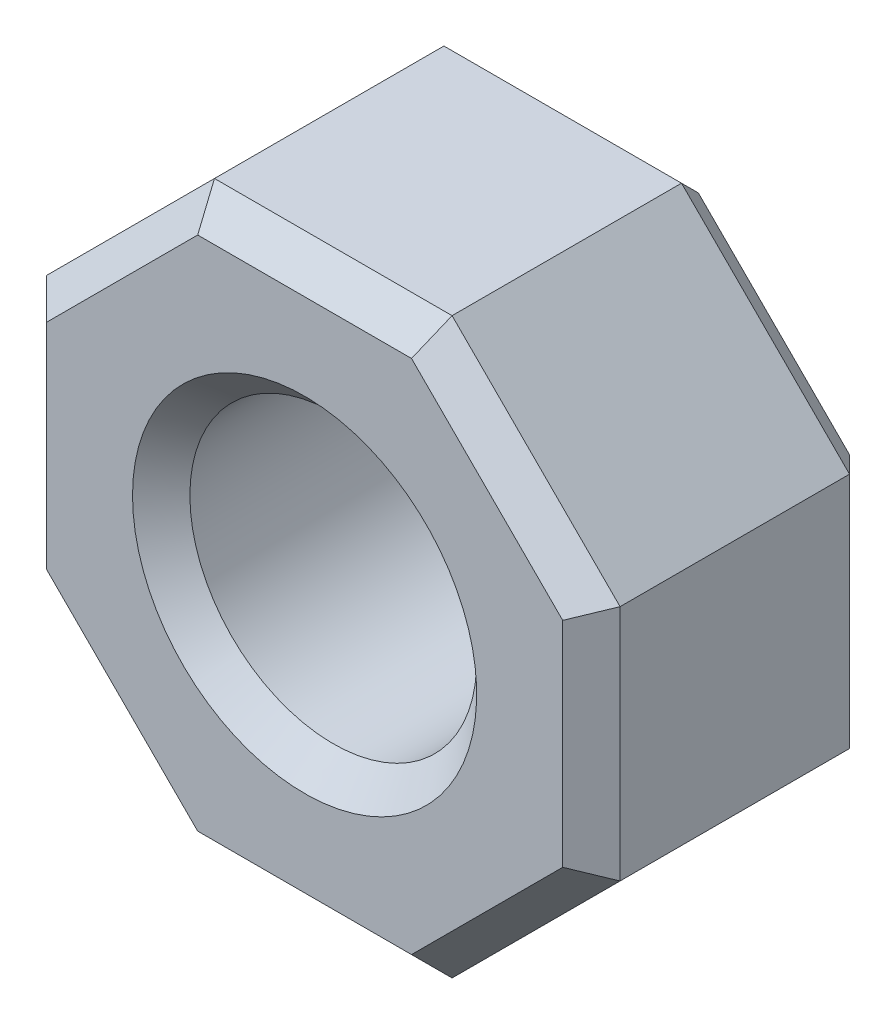
ISO-10303-21;
HEADER;
FILE_DESCRIPTION(('STEP AP214'),'2;1');
FILE_NAME('part.step','',(''),(''),'','','');
FILE_SCHEMA(('AUTOMOTIVE_DESIGN { 1 0 10303 214 1 1 1 1 }'));
ENDSEC;
DATA;
#1=APPLICATION_CONTEXT('core data for automotive mechanical design processes');
#2=APPLICATION_PROTOCOL_DEFINITION('international standard','automotive_design',2000,#1);
#3=PRODUCT_CONTEXT('',#1,'mechanical');
#4=PRODUCT('Part','Part','',(#3));
#5=PRODUCT_RELATED_PRODUCT_CATEGORY('part','',(#4));
#6=PRODUCT_DEFINITION_FORMATION('','',#4);
#7=PRODUCT_DEFINITION_CONTEXT('part definition',#1,'design');
#8=PRODUCT_DEFINITION('design','',#6,#7);
#9=PRODUCT_DEFINITION_SHAPE('','',#8);
#10=(LENGTH_UNIT() NAMED_UNIT(*) SI_UNIT(.MILLI.,.METRE.));
#11=(NAMED_UNIT(*) PLANE_ANGLE_UNIT() SI_UNIT($,.RADIAN.));
#12=(NAMED_UNIT(*) SI_UNIT($,.STERADIAN.) SOLID_ANGLE_UNIT());
#13=UNCERTAINTY_MEASURE_WITH_UNIT(LENGTH_MEASURE(1.E-05),#10,'distance_accuracy_value','');
#14=(GEOMETRIC_REPRESENTATION_CONTEXT(3) GLOBAL_UNCERTAINTY_ASSIGNED_CONTEXT((#13)) GLOBAL_UNIT_ASSIGNED_CONTEXT((#10,
#11,#12)) REPRESENTATION_CONTEXT('',''));
#15=CARTESIAN_POINT('',(0.,0.,0.));
#16=DIRECTION('',(0.,0.,1.));
#17=DIRECTION('',(1.,0.,0.));
#18=AXIS2_PLACEMENT_3D('',#15,#16,#17);
#19=CARTESIAN_POINT('',(25.0000000000003,25.0000000000007,25.000000000001));
#20=DIRECTION('',(0.,0.,-0.999999999999998));
#21=DIRECTION('',(-1.00000000000002,0.,0.));
#22=AXIS2_PLACEMENT_3D('',#19,#20,#21);
#23=PLANE('',#22);
#24=CARTESIAN_POINT('',(0.,1.11022302462516E-13,24.9999999999999));
#25=DIRECTION('',(0.,0.,-0.999999999999998));
#26=DIRECTION('',(-1.00000000000002,0.,0.));
#27=AXIS2_PLACEMENT_3D('',#24,#25,#26);
#28=CIRCLE('',#27,15.);
#29=CARTESIAN_POINT('',(-15.0000000000004,1.1518563880486E-13,24.9999999999999));
#30=VERTEX_POINT('',#29);
#31=EDGE_CURVE('E227',#30,#30,#28,.T.);
#32=ORIENTED_EDGE('',*,*,#31,.T.);
#33=EDGE_LOOP('',(#32));
#34=FACE_BOUND('',#33,.T.);
#35=DIRECTION('',(0.,1.00000000000002,0.));
#36=VECTOR('',#35,1.);
#37=CARTESIAN_POINT('',(22.5000000000006,25.0000000000012,25.0000000000006));
#38=LINE('',#37,#36);
#39=CARTESIAN_POINT('',(22.5000000000014,-9.31980515339428,25.0000000000019));
#40=VERTEX_POINT('',#39);
#41=CARTESIAN_POINT('',(22.5000000000003,9.31980515339542,25.0000000000019));
#42=VERTEX_POINT('',#41);
#43=EDGE_CURVE('E222',#40,#42,#38,.T.);
#44=ORIENTED_EDGE('',*,*,#43,.T.);
#45=DIRECTION('',(-0.707106781186565,0.707106781186561,0.));
#46=VECTOR('',#45,1.);
#47=CARTESIAN_POINT('',(15.9099025766984,15.9099025766978,25.0000000000001));
#48=LINE('',#47,#46);
#49=CARTESIAN_POINT('',(9.31980515339478,22.5000000000008,25.0000000000037));
#50=VERTEX_POINT('',#49);
#51=EDGE_CURVE('E224',#42,#50,#48,.T.);
#52=ORIENTED_EDGE('',*,*,#51,.T.);
#53=DIRECTION('',(-1.00000000000002,0.,0.));
#54=VECTOR('',#53,1.);
#55=CARTESIAN_POINT('',(25.0000000000004,22.5000000000011,25.0000000000019));
#56=LINE('',#55,#54);
#57=CARTESIAN_POINT('',(-9.31980515339506,22.5000000000011,25.0000000000017));
#58=VERTEX_POINT('',#57);
#59=EDGE_CURVE('E210',#50,#58,#56,.T.);
#60=ORIENTED_EDGE('',*,*,#59,.T.);
#61=DIRECTION('',(-0.707106781186559,-0.707106781186568,0.));
#62=VECTOR('',#61,1.);
#63=CARTESIAN_POINT('',(9.090097423302,40.9099025766983,24.9999999999966));
#64=LINE('',#63,#62);
#65=CARTESIAN_POINT('',(-22.5000000000007,9.31980515339506,25.0000000000035));
#66=VERTEX_POINT('',#65);
#67=EDGE_CURVE('E212',#58,#66,#64,.T.);
#68=ORIENTED_EDGE('',*,*,#67,.T.);
#69=DIRECTION('',(0.,-1.00000000000002,0.));
#70=VECTOR('',#69,1.);
#71=CARTESIAN_POINT('',(-22.500000000002,25.000000000001,25.0000000000032));
#72=LINE('',#71,#70);
#73=CARTESIAN_POINT('',(-22.5000000000019,-9.31980515339476,25.0000000000017));
#74=VERTEX_POINT('',#73);
#75=EDGE_CURVE('E214',#66,#74,#72,.T.);
#76=ORIENTED_EDGE('',*,*,#75,.T.);
#77=DIRECTION('',(0.707106781186565,-0.707106781186561,0.));
#78=VECTOR('',#77,1.);
#79=CARTESIAN_POINT('',(-15.9099025766985,-15.9099025766972,25.0000000000017));
#80=LINE('',#79,#78);
#81=CARTESIAN_POINT('',(-9.31980515339573,-22.5000000000001,24.9999999999999));
#82=VERTEX_POINT('',#81);
#83=EDGE_CURVE('E216',#74,#82,#80,.T.);
#84=ORIENTED_EDGE('',*,*,#83,.T.);
#85=DIRECTION('',(1.00000000000002,0.,0.));
#86=VECTOR('',#85,1.);
#87=CARTESIAN_POINT('',(25.0000000000002,-22.5000000000003,25.0000000000055));
#88=LINE('',#87,#86);
#89=CARTESIAN_POINT('',(9.31980515339392,-22.5,25.0000000000035));
#90=VERTEX_POINT('',#89);
#91=EDGE_CURVE('E218',#82,#90,#88,.T.);
#92=ORIENTED_EDGE('',*,*,#91,.T.);
#93=DIRECTION('',(0.707106781186559,0.707106781186567,0.));
#94=VECTOR('',#93,1.);
#95=CARTESIAN_POINT('',(40.9099025766981,9.0900974233035,25.000000000003));
#96=LINE('',#95,#94);
#97=EDGE_CURVE('E220',#90,#40,#96,.T.);
#98=ORIENTED_EDGE('',*,*,#97,.T.);
#99=EDGE_LOOP('',(#44,#52,#60,#68,#76,#84,#92,#98));
#100=FACE_BOUND('',#99,.T.);
#101=ADVANCED_FACE('F34',(#34,#100),#23,.F.);
#102=CARTESIAN_POINT('',(25.0000000000006,25.0000000000007,1.77635683940025E-12));
#103=DIRECTION('',(0.,0.,-0.999999999999998));
#104=DIRECTION('',(-1.00000000000002,0.,0.));
#105=AXIS2_PLACEMENT_3D('',#102,#103,#104);
#106=PLANE('',#105);
#107=CARTESIAN_POINT('',(0.,0.,0.));
#108=DIRECTION('',(0.,0.,-0.999999999999998));
#109=DIRECTION('',(-1.00000000000002,0.,0.));
#110=AXIS2_PLACEMENT_3D('',#107,#108,#109);
#111=CIRCLE('',#110,15.);
#112=CARTESIAN_POINT('',(-15.0000000000003,0.,0.));
#113=VERTEX_POINT('',#112);
#114=EDGE_CURVE('E174',#113,#113,#111,.F.);
#115=ORIENTED_EDGE('',*,*,#114,.T.);
#116=EDGE_LOOP('',(#115));
#117=FACE_BOUND('',#116,.T.);
#118=DIRECTION('',(0.,1.00000000000002,0.));
#119=VECTOR('',#118,1.);
#120=CARTESIAN_POINT('',(-22.5000000000001,10.3553390593274,3.5527136788005E-12));
#121=LINE('',#120,#119);
#122=CARTESIAN_POINT('',(-22.5000000000019,-9.31980515339487,1.77635683940025E-12));
#123=VERTEX_POINT('',#122);
#124=CARTESIAN_POINT('',(-22.5000000000013,9.31980515339456,3.5527136788005E-12));
#125=VERTEX_POINT('',#124);
#126=EDGE_CURVE('E173',#123,#125,#121,.T.);
#127=ORIENTED_EDGE('',*,*,#126,.T.);
#128=DIRECTION('',(0.707106781186559,0.707106781186568,0.));
#129=VECTOR('',#128,1.);
#130=CARTESIAN_POINT('',(-8.58757210636099,23.2322330470339,1.77635683940025E-12));
#131=LINE('',#130,#129);
#132=CARTESIAN_POINT('',(-9.31980515339417,22.5000000000006,1.77635683940025E-12));
#133=VERTEX_POINT('',#132);
#134=EDGE_CURVE('E152',#125,#133,#131,.T.);
#135=ORIENTED_EDGE('',*,*,#134,.T.);
#136=DIRECTION('',(1.00000000000002,0.,0.));
#137=VECTOR('',#136,1.);
#138=CARTESIAN_POINT('',(10.3553390593278,22.5000000000006,1.77635683940025E-12));
#139=LINE('',#138,#137);
#140=CARTESIAN_POINT('',(9.31980515339514,22.5000000000009,3.5527136788005E-12));
#141=VERTEX_POINT('',#140);
#142=EDGE_CURVE('E162',#133,#141,#139,.T.);
#143=ORIENTED_EDGE('',*,*,#142,.T.);
#144=DIRECTION('',(0.707106781186565,-0.707106781186561,0.));
#145=VECTOR('',#144,1.);
#146=CARTESIAN_POINT('',(23.2322330470343,8.58757210636138,1.77635683940025E-12));
#147=LINE('',#146,#145);
#148=CARTESIAN_POINT('',(22.500000000001,9.31980515339509,1.77635683940025E-12));
#149=VERTEX_POINT('',#148);
#150=EDGE_CURVE('E168',#141,#149,#147,.T.);
#151=ORIENTED_EDGE('',*,*,#150,.T.);
#152=DIRECTION('',(0.,-1.00000000000002,0.));
#153=VECTOR('',#152,1.);
#154=CARTESIAN_POINT('',(22.5,-10.3553390593276,1.77635683940025E-12));
#155=LINE('',#154,#153);
#156=CARTESIAN_POINT('',(22.5,-9.31980515339458,1.77635683940025E-12));
#157=VERTEX_POINT('',#156);
#158=EDGE_CURVE('E352',#149,#157,#155,.T.);
#159=ORIENTED_EDGE('',*,*,#158,.T.);
#160=DIRECTION('',(-0.707106781186559,-0.707106781186567,0.));
#161=VECTOR('',#160,1.);
#162=CARTESIAN_POINT('',(8.58757210636055,-23.2322330470337,5.32907051820075E-12));
#163=LINE('',#162,#161);
#164=CARTESIAN_POINT('',(9.3198051533937,-22.5000000000002,3.5527136788005E-12));
#165=VERTEX_POINT('',#164);
#166=EDGE_CURVE('E354',#157,#165,#163,.T.);
#167=ORIENTED_EDGE('',*,*,#166,.T.);
#168=DIRECTION('',(-1.00000000000002,0.,0.));
#169=VECTOR('',#168,1.);
#170=CARTESIAN_POINT('',(-10.3553390593287,-22.5000000000005,0.));
#171=LINE('',#170,#169);
#172=CARTESIAN_POINT('',(-9.31980515339573,-22.5000000000004,0.));
#173=VERTEX_POINT('',#172);
#174=EDGE_CURVE('E356',#165,#173,#171,.T.);
#175=ORIENTED_EDGE('',*,*,#174,.T.);
#176=DIRECTION('',(-0.707106781186565,0.707106781186561,0.));
#177=VECTOR('',#176,1.);
#178=CARTESIAN_POINT('',(-23.232233047034,-8.58757210636123,1.77635683940025E-12));
#179=LINE('',#178,#177);
#180=EDGE_CURVE('E179',#173,#123,#179,.T.);
#181=ORIENTED_EDGE('',*,*,#180,.T.);
#182=EDGE_LOOP('',(#127,#135,#143,#151,#159,#167,#175,#181));
#183=FACE_BOUND('',#182,.T.);
#184=ADVANCED_FACE('F171',(#117,#183),#106,.T.);
#185=CARTESIAN_POINT('',(-10.3553390593283,25.0000000000008,25.0000000000035));
#186=DIRECTION('',(0.,-1.00000000000002,0.));
#187=DIRECTION('',(1.00000000000002,0.,0.));
#188=AXIS2_PLACEMENT_3D('',#185,#186,#187);
#189=PLANE('',#188);
#190=DIRECTION('',(0.,0.,-0.999999999999998));
#191=VECTOR('',#190,1.);
#192=CARTESIAN_POINT('',(-10.3553390593283,25.0000000000008,25.0000000000035));
#193=LINE('',#192,#191);
#194=CARTESIAN_POINT('',(-10.3553390593275,25.0000000000013,22.5000000000035));
#195=VERTEX_POINT('',#194);
#196=CARTESIAN_POINT('',(-10.3553390593272,25.0000000000012,2.5000000000035));
#197=VERTEX_POINT('',#196);
#198=EDGE_CURVE('E169',#195,#197,#193,.T.);
#199=ORIENTED_EDGE('',*,*,#198,.F.);
#200=DIRECTION('',(1.00000000000002,0.,0.));
#201=VECTOR('',#200,1.);
#202=CARTESIAN_POINT('',(-10.3553390593275,25.0000000000013,22.5000000000035));
#203=LINE('',#202,#201);
#204=CARTESIAN_POINT('',(10.355339059327,25.0000000000012,22.5000000000035));
#205=VERTEX_POINT('',#204);
#206=EDGE_CURVE('E11',#195,#205,#203,.T.);
#207=ORIENTED_EDGE('',*,*,#206,.T.);
#208=DIRECTION('',(0.,0.,-0.999999999999998));
#209=VECTOR('',#208,1.);
#210=CARTESIAN_POINT('',(10.355339059327,25.000000000001,25.0000000000037));
#211=LINE('',#210,#209);
#212=CARTESIAN_POINT('',(10.355339059327,25.0000000000015,2.5000000000035));
#213=VERTEX_POINT('',#212);
#214=EDGE_CURVE('E287',#205,#213,#211,.T.);
#215=ORIENTED_EDGE('',*,*,#214,.T.);
#216=DIRECTION('',(-1.00000000000002,0.,0.));
#217=VECTOR('',#216,1.);
#218=CARTESIAN_POINT('',(-10.3553390593272,25.0000000000012,2.5000000000035));
#219=LINE('',#218,#217);
#220=EDGE_CURVE('E204',#213,#197,#219,.T.);
#221=ORIENTED_EDGE('',*,*,#220,.T.);
#222=EDGE_LOOP('',(#199,#207,#215,#221));
#223=FACE_BOUND('',#222,.T.);
#224=ADVANCED_FACE('F36',(#223),#189,.F.);
#225=CARTESIAN_POINT('',(-25.0000000000006,10.3553390593278,25.0000000000035));
#226=DIRECTION('',(0.707106781186565,-0.707106781186559,0.));
#227=DIRECTION('',(0.707106781186559,0.707106781186565,0.));
#228=AXIS2_PLACEMENT_3D('',#225,#226,#227);
#229=PLANE('',#228);
#230=DIRECTION('',(0.,0.,-0.999999999999998));
#231=VECTOR('',#230,1.);
#232=CARTESIAN_POINT('',(-25.0000000000006,10.3553390593278,25.0000000000035));
#233=LINE('',#232,#231);
#234=CARTESIAN_POINT('',(-25.0000000000003,10.3553390593278,22.5000000000035));
#235=VERTEX_POINT('',#234);
#236=CARTESIAN_POINT('',(-25.0000000000003,10.355339059328,2.5000000000035));
#237=VERTEX_POINT('',#236);
#238=EDGE_CURVE('E254',#235,#237,#233,.T.);
#239=ORIENTED_EDGE('',*,*,#238,.F.);
#240=DIRECTION('',(0.707106781186559,0.707106781186565,0.));
#241=VECTOR('',#240,1.);
#242=CARTESIAN_POINT('',(-25.0000000000003,10.3553390593278,22.5000000000035));
#243=LINE('',#242,#241);
#244=EDGE_CURVE('E42',#235,#195,#243,.T.);
#245=ORIENTED_EDGE('',*,*,#244,.T.);
#246=ORIENTED_EDGE('',*,*,#198,.T.);
#247=DIRECTION('',(-0.707106781186559,-0.707106781186565,0.));
#248=VECTOR('',#247,1.);
#249=CARTESIAN_POINT('',(-25.0000000000003,10.355339059328,2.5000000000035));
#250=LINE('',#249,#248);
#251=EDGE_CURVE('E155',#197,#237,#250,.T.);
#252=ORIENTED_EDGE('',*,*,#251,.T.);
#253=EDGE_LOOP('',(#239,#245,#246,#252));
#254=FACE_BOUND('',#253,.T.);
#255=ADVANCED_FACE('F365',(#254),#229,.F.);
#256=CARTESIAN_POINT('',(-25.,-10.3553390593272,25.0000000000017));
#257=DIRECTION('',(1.00000000000002,0.,0.));
#258=DIRECTION('',(0.,0.,-0.999999999999998));
#259=AXIS2_PLACEMENT_3D('',#256,#257,#258);
#260=PLANE('',#259);
#261=DIRECTION('',(0.,0.,-0.999999999999998));
#262=VECTOR('',#261,1.);
#263=CARTESIAN_POINT('',(-25.,-10.3553390593272,25.0000000000017));
#264=LINE('',#263,#262);
#265=CARTESIAN_POINT('',(-25.0000000000002,-10.3553390593275,22.5000000000017));
#266=VERTEX_POINT('',#265);
#267=CARTESIAN_POINT('',(-25.0000000000012,-10.3553390593274,2.50000000000172));
#268=VERTEX_POINT('',#267);
#269=EDGE_CURVE('E245',#266,#268,#264,.T.);
#270=ORIENTED_EDGE('',*,*,#269,.F.);
#271=DIRECTION('',(0.,1.00000000000002,0.));
#272=VECTOR('',#271,1.);
#273=CARTESIAN_POINT('',(-25.0000000000002,-10.3553390593275,22.5000000000017));
#274=LINE('',#273,#272);
#275=EDGE_CURVE('E56',#266,#235,#274,.T.);
#276=ORIENTED_EDGE('',*,*,#275,.T.);
#277=ORIENTED_EDGE('',*,*,#238,.T.);
#278=DIRECTION('',(0.,-1.00000000000002,0.));
#279=VECTOR('',#278,1.);
#280=CARTESIAN_POINT('',(-25.0000000000012,-10.3553390593274,2.50000000000172));
#281=LINE('',#280,#279);
#282=EDGE_CURVE('E186',#237,#268,#281,.T.);
#283=ORIENTED_EDGE('',*,*,#282,.T.);
#284=EDGE_LOOP('',(#270,#276,#277,#283));
#285=FACE_BOUND('',#284,.T.);
#286=ADVANCED_FACE('F251',(#285),#260,.F.);
#287=CARTESIAN_POINT('',(-10.3553390593289,-25.0000000000001,25.0000000000017));
#288=DIRECTION('',(0.707106781186561,0.707106781186565,0.));
#289=DIRECTION('',(-0.707106781186565,0.707106781186561,0.));
#290=AXIS2_PLACEMENT_3D('',#287,#288,#289);
#291=PLANE('',#290);
#292=DIRECTION('',(0.,0.,-0.999999999999998));
#293=VECTOR('',#292,1.);
#294=CARTESIAN_POINT('',(-10.3553390593289,-25.0000000000001,25.0000000000017));
#295=LINE('',#294,#293);
#296=CARTESIAN_POINT('',(-10.3553390593289,-25.0000000000001,22.5000000000017));
#297=VERTEX_POINT('',#296);
#298=CARTESIAN_POINT('',(-10.3553390593295,-25.0000000000003,2.50000000000172));
#299=VERTEX_POINT('',#298);
#300=EDGE_CURVE('E246',#297,#299,#295,.T.);
#301=ORIENTED_EDGE('',*,*,#300,.F.);
#302=DIRECTION('',(-0.707106781186565,0.707106781186561,0.));
#303=VECTOR('',#302,1.);
#304=CARTESIAN_POINT('',(-10.3553390593289,-25.0000000000001,22.5000000000017));
#305=LINE('',#304,#303);
#306=EDGE_CURVE('E239',#297,#266,#305,.T.);
#307=ORIENTED_EDGE('',*,*,#306,.T.);
#308=ORIENTED_EDGE('',*,*,#269,.T.);
#309=DIRECTION('',(0.707106781186565,-0.707106781186561,0.));
#310=VECTOR('',#309,1.);
#311=CARTESIAN_POINT('',(-10.3553390593295,-25.0000000000003,2.50000000000172));
#312=LINE('',#311,#310);
#313=EDGE_CURVE('E189',#268,#299,#312,.T.);
#314=ORIENTED_EDGE('',*,*,#313,.T.);
#315=EDGE_LOOP('',(#301,#307,#308,#314));
#316=FACE_BOUND('',#315,.T.);
#317=ADVANCED_FACE('F244',(#316),#291,.F.);
#318=CARTESIAN_POINT('',(10.3553390593273,-25.0000000000001,25.0000000000052));
#319=DIRECTION('',(0.,1.00000000000002,0.));
#320=DIRECTION('',(-1.00000000000002,0.,0.));
#321=AXIS2_PLACEMENT_3D('',#318,#319,#320);
#322=PLANE('',#321);
#323=DIRECTION('',(0.,0.,-0.999999999999998));
#324=VECTOR('',#323,1.);
#325=CARTESIAN_POINT('',(10.3553390593273,-25.0000000000001,25.0000000000052));
#326=LINE('',#325,#324);
#327=CARTESIAN_POINT('',(10.3553390593278,-25.0000000000001,22.5000000000053));
#328=VERTEX_POINT('',#327);
#329=CARTESIAN_POINT('',(10.3553390593273,-25.0000000000002,2.50000000000528));
#330=VERTEX_POINT('',#329);
#331=EDGE_CURVE('E317',#328,#330,#326,.T.);
#332=ORIENTED_EDGE('',*,*,#331,.F.);
#333=DIRECTION('',(-1.00000000000002,0.,0.));
#334=VECTOR('',#333,1.);
#335=CARTESIAN_POINT('',(10.3553390593278,-25.0000000000001,22.5000000000053));
#336=LINE('',#335,#334);
#337=EDGE_CURVE('E237',#328,#297,#336,.T.);
#338=ORIENTED_EDGE('',*,*,#337,.T.);
#339=ORIENTED_EDGE('',*,*,#300,.T.);
#340=DIRECTION('',(1.00000000000002,0.,0.));
#341=VECTOR('',#340,1.);
#342=CARTESIAN_POINT('',(10.3553390593273,-25.0000000000002,2.50000000000528));
#343=LINE('',#342,#341);
#344=EDGE_CURVE('E192',#299,#330,#343,.T.);
#345=ORIENTED_EDGE('',*,*,#344,.T.);
#346=EDGE_LOOP('',(#332,#338,#339,#345));
#347=FACE_BOUND('',#346,.T.);
#348=ADVANCED_FACE('F390',(#347),#322,.F.);
#349=CARTESIAN_POINT('',(25.0000000000004,-10.3553390593274,25.0000000000019));
#350=DIRECTION('',(-0.707106781186567,0.707106781186559,0.));
#351=DIRECTION('',(-0.707106781186559,-0.707106781186567,0.));
#352=AXIS2_PLACEMENT_3D('',#349,#350,#351);
#353=PLANE('',#352);
#354=DIRECTION('',(0.,0.,-0.999999999999998));
#355=VECTOR('',#354,1.);
#356=CARTESIAN_POINT('',(25.0000000000004,-10.3553390593274,25.0000000000019));
#357=LINE('',#356,#355);
#358=CARTESIAN_POINT('',(25.0000000000006,-10.3553390593276,22.5000000000017));
#359=VERTEX_POINT('',#358);
#360=CARTESIAN_POINT('',(25.0000000000002,-10.3553390593271,2.50000000000195));
#361=VERTEX_POINT('',#360);
#362=EDGE_CURVE('E310',#359,#361,#357,.T.);
#363=ORIENTED_EDGE('',*,*,#362,.F.);
#364=DIRECTION('',(-0.707106781186559,-0.707106781186567,0.));
#365=VECTOR('',#364,1.);
#366=CARTESIAN_POINT('',(25.0000000000006,-10.3553390593276,22.5000000000017));
#367=LINE('',#366,#365);
#368=EDGE_CURVE('E235',#359,#328,#367,.T.);
#369=ORIENTED_EDGE('',*,*,#368,.T.);
#370=ORIENTED_EDGE('',*,*,#331,.T.);
#371=DIRECTION('',(0.707106781186559,0.707106781186567,0.));
#372=VECTOR('',#371,1.);
#373=CARTESIAN_POINT('',(25.0000000000002,-10.3553390593271,2.50000000000195));
#374=LINE('',#373,#372);
#375=EDGE_CURVE('E195',#330,#361,#374,.T.);
#376=ORIENTED_EDGE('',*,*,#375,.T.);
#377=EDGE_LOOP('',(#363,#369,#370,#376));
#378=FACE_BOUND('',#377,.T.);
#379=ADVANCED_FACE('F313',(#378),#353,.F.);
#380=CARTESIAN_POINT('',(25.0000000000002,10.3553390593281,25.0000000000019));
#381=DIRECTION('',(-1.00000000000002,0.,0.));
#382=DIRECTION('',(0.,0.,0.999999999999998));
#383=AXIS2_PLACEMENT_3D('',#380,#381,#382);
#384=PLANE('',#383);
#385=DIRECTION('',(0.,0.,-0.999999999999998));
#386=VECTOR('',#385,1.);
#387=CARTESIAN_POINT('',(25.0000000000002,10.3553390593281,25.0000000000019));
#388=LINE('',#387,#386);
#389=CARTESIAN_POINT('',(25.0000000000008,10.355339059328,22.500000000002));
#390=VERTEX_POINT('',#389);
#391=CARTESIAN_POINT('',(25.0000000000009,10.3553390593284,2.50000000000195));
#392=VERTEX_POINT('',#391);
#393=EDGE_CURVE('E293',#390,#392,#388,.T.);
#394=ORIENTED_EDGE('',*,*,#393,.F.);
#395=DIRECTION('',(0.,-1.00000000000002,0.));
#396=VECTOR('',#395,1.);
#397=CARTESIAN_POINT('',(25.0000000000008,10.355339059328,22.500000000002));
#398=LINE('',#397,#396);
#399=EDGE_CURVE('E233',#390,#359,#398,.T.);
#400=ORIENTED_EDGE('',*,*,#399,.T.);
#401=ORIENTED_EDGE('',*,*,#362,.T.);
#402=DIRECTION('',(0.,1.00000000000002,0.));
#403=VECTOR('',#402,1.);
#404=CARTESIAN_POINT('',(25.0000000000009,10.3553390593284,2.50000000000195));
#405=LINE('',#404,#403);
#406=EDGE_CURVE('E198',#361,#392,#405,.T.);
#407=ORIENTED_EDGE('',*,*,#406,.T.);
#408=EDGE_LOOP('',(#394,#400,#401,#407));
#409=FACE_BOUND('',#408,.T.);
#410=ADVANCED_FACE('F309',(#409),#384,.F.);
#411=CARTESIAN_POINT('',(10.355339059327,25.000000000001,25.0000000000037));
#412=DIRECTION('',(-0.707106781186561,-0.707106781186565,0.));
#413=DIRECTION('',(0.707106781186565,-0.707106781186561,0.));
#414=AXIS2_PLACEMENT_3D('',#411,#412,#413);
#415=PLANE('',#414);
#416=ORIENTED_EDGE('',*,*,#214,.F.);
#417=DIRECTION('',(0.707106781186565,-0.707106781186561,0.));
#418=VECTOR('',#417,1.);
#419=CARTESIAN_POINT('',(10.355339059327,25.0000000000012,22.5000000000035));
#420=LINE('',#419,#418);
#421=EDGE_CURVE('E230',#205,#390,#420,.T.);
#422=ORIENTED_EDGE('',*,*,#421,.T.);
#423=ORIENTED_EDGE('',*,*,#393,.T.);
#424=DIRECTION('',(-0.707106781186565,0.707106781186561,0.));
#425=VECTOR('',#424,1.);
#426=CARTESIAN_POINT('',(10.355339059327,25.0000000000015,2.5000000000035));
#427=LINE('',#426,#425);
#428=EDGE_CURVE('E201',#392,#213,#427,.T.);
#429=ORIENTED_EDGE('',*,*,#428,.T.);
#430=EDGE_LOOP('',(#416,#422,#423,#429));
#431=FACE_BOUND('',#430,.T.);
#432=ADVANCED_FACE('F290',(#431),#415,.F.);
#433=CARTESIAN_POINT('',(0.,1.11022302462516E-13,24.9999999999999));
#434=DIRECTION('',(0.,0.,-0.999999999999998));
#435=DIRECTION('',(-1.00000000000002,0.,0.));
#436=AXIS2_PLACEMENT_3D('',#433,#434,#435);
#437=CYLINDRICAL_SURFACE('',#436,12.5);
#438=CARTESIAN_POINT('',(0.,0.,22.5));
#439=DIRECTION('',(0.,0.,-0.999999999999998));
#440=DIRECTION('',(-1.00000000000002,0.,0.));
#441=AXIS2_PLACEMENT_3D('',#438,#439,#440);
#442=CIRCLE('',#441,12.5);
#443=CARTESIAN_POINT('',(-12.5000000000003,1.14491749414469E-13,22.5));
#444=VERTEX_POINT('',#443);
#445=EDGE_CURVE('E207',#444,#444,#442,.F.);
#446=CARTESIAN_POINT('',(4.44089209850063E-13,3.60822483003176E-13,2.49999999999995));
#447=DIRECTION('',(0.,0.,-0.999999999999998));
#448=DIRECTION('',(-1.00000000000002,0.,0.));
#449=AXIS2_PLACEMENT_3D('',#446,#447,#448);
#450=CIRCLE('',#449,12.5);
#451=CARTESIAN_POINT('',(-12.5000000000003,1.14491749414469E-13,2.49999999999995));
#452=VERTEX_POINT('',#451);
#453=EDGE_CURVE('E177',#452,#452,#450,.T.);
#454=CARTESIAN_POINT('',(-12.5000000000003,1.14491749414469E-13,22.5));
#455=CARTESIAN_POINT('',(-12.5000000000003,1.14491749414469E-13,22.2916666666666));
#456=CARTESIAN_POINT('',(-12.5000000000003,1.14491749414469E-13,22.0833333333333));
#457=CARTESIAN_POINT('',(-12.5000000000003,1.14491749414469E-13,21.6666666666666));
#458=CARTESIAN_POINT('',(-12.5000000000003,1.14491749414469E-13,21.4583333333333));
#459=CARTESIAN_POINT('',(-12.5000000000003,1.14491749414469E-13,21.0416666666666));
#460=CARTESIAN_POINT('',(-12.5000000000003,1.14491749414469E-13,20.8333333333333));
#461=CARTESIAN_POINT('',(-12.5000000000003,1.14491749414469E-13,20.4166666666666));
#462=CARTESIAN_POINT('',(-12.5000000000003,1.14491749414469E-13,20.2083333333333));
#463=CARTESIAN_POINT('',(-12.5000000000003,1.14491749414469E-13,19.7916666666666));
#464=CARTESIAN_POINT('',(-12.5000000000003,1.14491749414469E-13,19.5833333333333));
#465=CARTESIAN_POINT('',(-12.5000000000003,1.14491749414469E-13,19.1666666666666));
#466=CARTESIAN_POINT('',(-12.5000000000003,1.14491749414469E-13,18.9583333333333));
#467=CARTESIAN_POINT('',(-12.5000000000003,1.14491749414469E-13,18.5416666666666));
#468=CARTESIAN_POINT('',(-12.5000000000003,1.14491749414469E-13,18.3333333333333));
#469=CARTESIAN_POINT('',(-12.5000000000003,1.14491749414469E-13,17.9166666666666));
#470=CARTESIAN_POINT('',(-12.5000000000003,1.14491749414469E-13,17.7083333333333));
#471=CARTESIAN_POINT('',(-12.5000000000003,1.14491749414469E-13,17.2916666666666));
#472=CARTESIAN_POINT('',(-12.5000000000003,1.14491749414469E-13,17.0833333333333));
#473=CARTESIAN_POINT('',(-12.5000000000003,1.14491749414469E-13,16.6666666666666));
#474=CARTESIAN_POINT('',(-12.5000000000003,1.14491749414469E-13,16.4583333333333));
#475=CARTESIAN_POINT('',(-12.5000000000003,1.14491749414469E-13,16.0416666666666));
#476=CARTESIAN_POINT('',(-12.5000000000003,1.14491749414469E-13,15.8333333333333));
#477=CARTESIAN_POINT('',(-12.5000000000003,1.14491749414469E-13,15.4166666666666));
#478=CARTESIAN_POINT('',(-12.5000000000003,1.14491749414469E-13,15.2083333333333));
#479=CARTESIAN_POINT('',(-12.5000000000003,1.14491749414469E-13,14.7916666666666));
#480=CARTESIAN_POINT('',(-12.5000000000003,1.14491749414469E-13,14.5833333333333));
#481=CARTESIAN_POINT('',(-12.5000000000003,1.14491749414469E-13,14.1666666666666));
#482=CARTESIAN_POINT('',(-12.5000000000003,1.14491749414469E-13,13.9583333333333));
#483=CARTESIAN_POINT('',(-12.5000000000003,1.14491749414469E-13,13.5416666666666));
#484=CARTESIAN_POINT('',(-12.5000000000003,1.14491749414469E-13,13.3333333333333));
#485=CARTESIAN_POINT('',(-12.5000000000003,1.14491749414469E-13,12.9166666666666));
#486=CARTESIAN_POINT('',(-12.5000000000003,1.14491749414469E-13,12.7083333333333));
#487=CARTESIAN_POINT('',(-12.5000000000003,1.14491749414469E-13,12.2916666666666));
#488=CARTESIAN_POINT('',(-12.5000000000003,1.14491749414469E-13,12.0833333333333));
#489=CARTESIAN_POINT('',(-12.5000000000003,1.14491749414469E-13,11.6666666666666));
#490=CARTESIAN_POINT('',(-12.5000000000003,1.14491749414469E-13,11.4583333333333));
#491=CARTESIAN_POINT('',(-12.5000000000003,1.14491749414469E-13,11.0416666666666));
#492=CARTESIAN_POINT('',(-12.5000000000003,1.14491749414469E-13,10.8333333333333));
#493=CARTESIAN_POINT('',(-12.5000000000003,1.14491749414469E-13,10.4166666666666));
#494=CARTESIAN_POINT('',(-12.5000000000003,1.14491749414469E-13,10.2083333333333));
#495=CARTESIAN_POINT('',(-12.5000000000003,1.14491749414469E-13,9.79166666666662));
#496=CARTESIAN_POINT('',(-12.5000000000003,1.14491749414469E-13,9.58333333333329));
#497=CARTESIAN_POINT('',(-12.5000000000003,1.14491749414469E-13,9.16666666666662));
#498=CARTESIAN_POINT('',(-12.5000000000003,1.14491749414469E-13,8.95833333333328));
#499=CARTESIAN_POINT('',(-12.5000000000003,1.14491749414469E-13,8.54166666666662));
#500=CARTESIAN_POINT('',(-12.5000000000003,1.14491749414469E-13,8.33333333333328));
#501=CARTESIAN_POINT('',(-12.5000000000003,1.14491749414469E-13,7.91666666666662));
#502=CARTESIAN_POINT('',(-12.5000000000003,1.14491749414469E-13,7.70833333333329));
#503=CARTESIAN_POINT('',(-12.5000000000003,1.14491749414469E-13,7.29166666666662));
#504=CARTESIAN_POINT('',(-12.5000000000003,1.14491749414469E-13,7.08333333333328));
#505=CARTESIAN_POINT('',(-12.5000000000003,1.14491749414469E-13,6.66666666666662));
#506=CARTESIAN_POINT('',(-12.5000000000003,1.14491749414469E-13,6.45833333333328));
#507=CARTESIAN_POINT('',(-12.5000000000003,1.14491749414469E-13,6.04166666666662));
#508=CARTESIAN_POINT('',(-12.5000000000003,1.14491749414469E-13,5.83333333333328));
#509=CARTESIAN_POINT('',(-12.5000000000003,1.14491749414469E-13,5.41666666666661));
#510=CARTESIAN_POINT('',(-12.5000000000003,1.14491749414469E-13,5.20833333333328));
#511=CARTESIAN_POINT('',(-12.5000000000003,1.14491749414469E-13,4.79166666666661));
#512=CARTESIAN_POINT('',(-12.5000000000003,1.14491749414469E-13,4.58333333333328));
#513=CARTESIAN_POINT('',(-12.5000000000003,1.14491749414469E-13,4.16666666666661));
#514=CARTESIAN_POINT('',(-12.5000000000003,1.14491749414469E-13,3.95833333333328));
#515=CARTESIAN_POINT('',(-12.5000000000003,1.14491749414469E-13,3.54166666666661));
#516=CARTESIAN_POINT('',(-12.5000000000003,1.14491749414469E-13,3.33333333333328));
#517=CARTESIAN_POINT('',(-12.5000000000003,1.14491749414469E-13,2.91666666666661));
#518=CARTESIAN_POINT('',(-12.5000000000003,1.14491749414469E-13,2.70833333333328));
#519=CARTESIAN_POINT('',(-12.5000000000003,1.14491749414469E-13,2.49999999999995));
#520=B_SPLINE_CURVE_WITH_KNOTS('',3,(#454,#455,#456,#457,#458,#459,#460,#461,#462,#463,#464,
#465,#466,#467,#468,#469,#470,#471,#472,#473,#474,#475,#476,#477,#478,#479,#480,#481,#482,#483,
#484,#485,#486,#487,#488,#489,#490,#491,#492,#493,#494,#495,#496,#497,#498,#499,#500,#501,#502,
#503,#504,#505,#506,#507,#508,#509,#510,#511,#512,#513,#514,#515,#516,#517,#518,#519),
.UNSPECIFIED.,.F.,.F.,(4,2,2,2,2,2,2,2,2,2,2,2,2,2,2,2,2,2,2,2,2,2,2,2,2,2,2,2,2,2,2,2,4),(0.,
0.625000000000001,1.25,1.875,2.5,3.125,3.75,4.375,5.,5.62500000000001,6.25000000000001,
6.87500000000001,7.50000000000001,8.12500000000001,8.75000000000001,9.37500000000001,10.,10.625,
11.25,11.875,12.5,13.125,13.75,14.375,15.,15.625,16.25,16.875,17.5,18.125,18.75,19.375,20.),.UNSPECIFIED.);
#521=EDGE_CURVE('BSEAM385',#444,#452,#520,.T.);
#522=ORIENTED_EDGE('',*,*,#445,.T.);
#523=ORIENTED_EDGE('',*,*,#453,.T.);
#524=ORIENTED_EDGE('',*,*,#521,.T.);
#525=ORIENTED_EDGE('',*,*,#521,.F.);
#526=EDGE_LOOP('',(#522,#524,#523,#525));
#527=FACE_BOUND('',#526,.T.);
#528=ADVANCED_FACE('F385',(#527),#437,.F.);
#529=CARTESIAN_POINT('',(0.,0.,0.));
#530=DIRECTION('',(0.,0.,-0.999999999999998));
#531=DIRECTION('',(-1.00000000000002,0.,0.));
#532=AXIS2_PLACEMENT_3D('',#529,#530,#531);
#533=CONICAL_SURFACE('',#532,15.,0.785398163397447);
#534=CARTESIAN_POINT('',(-12.5000000000003,0.,2.49999999999995));
#535=CARTESIAN_POINT('',(-12.526041666667,0.,2.47395833333328));
#536=CARTESIAN_POINT('',(-12.5520833333337,0.,2.44791666666661));
#537=CARTESIAN_POINT('',(-12.604166666667,0.,2.39583333333328));
#538=CARTESIAN_POINT('',(-12.6302083333337,0.,2.36979166666662));
#539=CARTESIAN_POINT('',(-12.682291666667,0.,2.31770833333328));
#540=CARTESIAN_POINT('',(-12.7083333333337,0.,2.29166666666662));
#541=CARTESIAN_POINT('',(-12.760416666667,0.,2.23958333333329));
#542=CARTESIAN_POINT('',(-12.7864583333337,0.,2.21354166666662));
#543=CARTESIAN_POINT('',(-12.838541666667,0.,2.16145833333329));
#544=CARTESIAN_POINT('',(-12.8645833333337,0.,2.13541666666662));
#545=CARTESIAN_POINT('',(-12.916666666667,0.,2.08333333333329));
#546=CARTESIAN_POINT('',(-12.9427083333337,0.,2.05729166666662));
#547=CARTESIAN_POINT('',(-12.994791666667,0.,2.00520833333329));
#548=CARTESIAN_POINT('',(-13.0208333333337,0.,1.97916666666662));
#549=CARTESIAN_POINT('',(-13.072916666667,0.,1.92708333333329));
#550=CARTESIAN_POINT('',(-13.0989583333337,0.,1.90104166666663));
#551=CARTESIAN_POINT('',(-13.151041666667,0.,1.84895833333329));
#552=CARTESIAN_POINT('',(-13.1770833333337,0.,1.82291666666663));
#553=CARTESIAN_POINT('',(-13.229166666667,0.,1.7708333333333));
#554=CARTESIAN_POINT('',(-13.2552083333337,0.,1.74479166666663));
#555=CARTESIAN_POINT('',(-13.307291666667,0.,1.6927083333333));
#556=CARTESIAN_POINT('',(-13.3333333333337,0.,1.66666666666663));
#557=CARTESIAN_POINT('',(-13.385416666667,0.,1.6145833333333));
#558=CARTESIAN_POINT('',(-13.4114583333337,0.,1.58854166666663));
#559=CARTESIAN_POINT('',(-13.463541666667,0.,1.5364583333333));
#560=CARTESIAN_POINT('',(-13.4895833333337,0.,1.51041666666663));
#561=CARTESIAN_POINT('',(-13.541666666667,0.,1.4583333333333));
#562=CARTESIAN_POINT('',(-13.5677083333337,0.,1.43229166666664));
#563=CARTESIAN_POINT('',(-13.619791666667,0.,1.3802083333333));
#564=CARTESIAN_POINT('',(-13.6458333333337,0.,1.35416666666664));
#565=CARTESIAN_POINT('',(-13.697916666667,0.,1.30208333333331));
#566=CARTESIAN_POINT('',(-13.7239583333337,0.,1.27604166666664));
#567=CARTESIAN_POINT('',(-13.776041666667,0.,1.22395833333331));
#568=CARTESIAN_POINT('',(-13.8020833333337,0.,1.19791666666664));
#569=CARTESIAN_POINT('',(-13.854166666667,0.,1.14583333333331));
#570=CARTESIAN_POINT('',(-13.8802083333337,0.,1.11979166666664));
#571=CARTESIAN_POINT('',(-13.932291666667,0.,1.06770833333331));
#572=CARTESIAN_POINT('',(-13.9583333333337,0.,1.04166666666664));
#573=CARTESIAN_POINT('',(-14.010416666667,0.,0.989583333333312));
#574=CARTESIAN_POINT('',(-14.0364583333337,0.,0.963541666666646));
#575=CARTESIAN_POINT('',(-14.088541666667,0.,0.911458333333314));
#576=CARTESIAN_POINT('',(-14.1145833333337,0.,0.885416666666648));
#577=CARTESIAN_POINT('',(-14.166666666667,0.,0.833333333333315));
#578=CARTESIAN_POINT('',(-14.1927083333337,0.,0.807291666666649));
#579=CARTESIAN_POINT('',(-14.244791666667,0.,0.755208333333317));
#580=CARTESIAN_POINT('',(-14.2708333333337,0.,0.729166666666651));
#581=CARTESIAN_POINT('',(-14.322916666667,0.,0.677083333333319));
#582=CARTESIAN_POINT('',(-14.3489583333337,0.,0.651041666666653));
#583=CARTESIAN_POINT('',(-14.401041666667,0.,0.598958333333321));
#584=CARTESIAN_POINT('',(-14.4270833333337,0.,0.572916666666655));
#585=CARTESIAN_POINT('',(-14.479166666667,0.,0.520833333333322));
#586=CARTESIAN_POINT('',(-14.5052083333337,0.,0.494791666666656));
#587=CARTESIAN_POINT('',(-14.557291666667,0.,0.442708333333324));
#588=CARTESIAN_POINT('',(-14.5833333333337,0.,0.416666666666658));
#589=CARTESIAN_POINT('',(-14.635416666667,0.,0.364583333333326));
#590=CARTESIAN_POINT('',(-14.6614583333337,0.,0.338541666666659));
#591=CARTESIAN_POINT('',(-14.713541666667,0.,0.286458333333327));
#592=CARTESIAN_POINT('',(-14.7395833333337,0.,0.260416666666661));
#593=CARTESIAN_POINT('',(-14.791666666667,0.,0.208333333333329));
#594=CARTESIAN_POINT('',(-14.8177083333337,0.,0.182291666666663));
#595=CARTESIAN_POINT('',(-14.869791666667,0.,0.130208333333331));
#596=CARTESIAN_POINT('',(-14.8958333333337,0.,0.104166666666665));
#597=CARTESIAN_POINT('',(-14.947916666667,0.,0.052083333333332));
#598=CARTESIAN_POINT('',(-14.9739583333337,0.,0.0260416666666657));
#599=CARTESIAN_POINT('',(-15.0000000000003,0.,0.));
#600=B_SPLINE_CURVE_WITH_KNOTS('',3,(#534,#535,#536,#537,#538,#539,#540,#541,#542,#543,#544,
#545,#546,#547,#548,#549,#550,#551,#552,#553,#554,#555,#556,#557,#558,#559,#560,#561,#562,#563,
#564,#565,#566,#567,#568,#569,#570,#571,#572,#573,#574,#575,#576,#577,#578,#579,#580,#581,#582,
#583,#584,#585,#586,#587,#588,#589,#590,#591,#592,#593,#594,#595,#596,#597,#598,#599),
.UNSPECIFIED.,.F.,.F.,(4,2,2,2,2,2,2,2,2,2,2,2,2,2,2,2,2,2,2,2,2,2,2,2,2,2,2,2,2,2,2,2,4),(0.,
0.110485434560396,0.220970869120794,0.33145630368119,0.441941738241586,0.552427172801984,
0.66291260736238,0.773398041922777,0.883883476483174,0.994368911043571,1.10485434560397,
1.21533978016437,1.32582521472476,1.43631064928516,1.54679608384556,1.65728151840595,
1.76776695296635,1.87825238752675,1.98873782208714,2.09922325664754,2.20970869120794,
2.32019412576833,2.43067956032873,2.54116499488913,2.65165042944952,2.76213586400992,
2.87262129857032,2.98310673313071,3.09359216769111,3.20407760225151,3.31456303681191,
3.4250484713723,3.5355339059327),.UNSPECIFIED.);
#601=EDGE_CURVE('BSEAM421',#452,#113,#600,.T.);
#602=ORIENTED_EDGE('',*,*,#453,.F.);
#603=ORIENTED_EDGE('',*,*,#114,.F.);
#604=ORIENTED_EDGE('',*,*,#601,.T.);
#605=ORIENTED_EDGE('',*,*,#601,.F.);
#606=EDGE_LOOP('',(#602,#604,#603,#605));
#607=FACE_BOUND('',#606,.T.);
#608=ADVANCED_FACE('F421',(#607),#533,.F.);
#609=CARTESIAN_POINT('',(25.0000000000002,-10.3553390593271,2.50000000000195));
#610=DIRECTION('',(0.500000000000013,-0.500000000000009,-0.707106781186546));
#611=DIRECTION('',(-0.816496580927744,0.,-0.577350269189625));
#612=AXIS2_PLACEMENT_3D('',#609,#610,#611);
#613=PLANE('',#612);
#614=DIRECTION('',(-0.281084637714828,0.678598344545862,-0.678598344545845));
#615=VECTOR('',#614,1.);
#616=CARTESIAN_POINT('',(8.71901792372731,-21.0495713220368,-1.45042867795997));
#617=LINE('',#616,#615);
#618=EDGE_CURVE('E341',#165,#330,#617,.F.);
#619=ORIENTED_EDGE('',*,*,#618,.F.);
#620=ORIENTED_EDGE('',*,*,#166,.F.);
#621=DIRECTION('',(-0.678598344545862,0.281084637714825,-0.678598344545846));
#622=VECTOR('',#621,1.);
#623=CARTESIAN_POINT('',(21.0495713220369,-8.71901792372731,-1.45042867796175));
#624=LINE('',#623,#622);
#625=EDGE_CURVE('E294',#361,#157,#624,.T.);
#626=ORIENTED_EDGE('',*,*,#625,.F.);
#627=ORIENTED_EDGE('',*,*,#375,.F.);
#628=EDGE_LOOP('',(#619,#620,#626,#627));
#629=FACE_BOUND('',#628,.T.);
#630=ADVANCED_FACE('F428',(#629),#613,.T.);
#631=CARTESIAN_POINT('',(25.0000000000009,10.3553390593284,2.50000000000195));
#632=DIRECTION('',(0.707106781186564,0.,-0.707106781186551));
#633=DIRECTION('',(-0.707106781186561,0.,-0.707106781186541));
#634=AXIS2_PLACEMENT_3D('',#631,#632,#633);
#635=PLANE('',#634);
#636=ORIENTED_EDGE('',*,*,#625,.T.);
#637=ORIENTED_EDGE('',*,*,#158,.F.);
#638=DIRECTION('',(-0.678598344545861,-0.281084637714829,-0.678598344545841));
#639=VECTOR('',#638,1.);
#640=CARTESIAN_POINT('',(21.0495713220371,8.71901792372773,-1.45042867795997));
#641=LINE('',#640,#639);
#642=EDGE_CURVE('E338',#392,#149,#641,.T.);
#643=ORIENTED_EDGE('',*,*,#642,.F.);
#644=ORIENTED_EDGE('',*,*,#406,.F.);
#645=EDGE_LOOP('',(#636,#637,#643,#644));
#646=FACE_BOUND('',#645,.T.);
#647=ADVANCED_FACE('F436',(#646),#635,.T.);
#648=CARTESIAN_POINT('',(10.3553390593273,-25.0000000000002,2.50000000000528));
#649=DIRECTION('',(0.,-0.707106781186561,-0.707106781186547));
#650=DIRECTION('',(0.,0.707106781186564,-0.707106781186544));
#651=AXIS2_PLACEMENT_3D('',#648,#649,#650);
#652=PLANE('',#651);
#653=ORIENTED_EDGE('',*,*,#618,.T.);
#654=ORIENTED_EDGE('',*,*,#344,.F.);
#655=DIRECTION('',(0.281084637714828,0.678598344545862,-0.678598344545841));
#656=VECTOR('',#655,1.);
#657=CARTESIAN_POINT('',(-8.71901792372831,-21.0495713220371,-1.45042867796374));
#658=LINE('',#657,#656);
#659=EDGE_CURVE('E335',#173,#299,#658,.F.);
#660=ORIENTED_EDGE('',*,*,#659,.F.);
#661=ORIENTED_EDGE('',*,*,#174,.F.);
#662=EDGE_LOOP('',(#653,#654,#660,#661));
#663=FACE_BOUND('',#662,.T.);
#664=ADVANCED_FACE('F444',(#663),#652,.T.);
#665=CARTESIAN_POINT('',(10.355339059327,25.0000000000015,2.5000000000035));
#666=DIRECTION('',(0.500000000000008,0.500000000000012,-0.70710678118655));
#667=DIRECTION('',(0.,0.816496580927746,0.577350269189622));
#668=AXIS2_PLACEMENT_3D('',#665,#666,#667);
#669=PLANE('',#668);
#670=ORIENTED_EDGE('',*,*,#642,.T.);
#671=ORIENTED_EDGE('',*,*,#150,.F.);
#672=DIRECTION('',(-0.281084637714826,-0.678598344545863,-0.678598344545845));
#673=VECTOR('',#672,1.);
#674=CARTESIAN_POINT('',(8.71901792372839,21.0495713220371,-1.45042867796175));
#675=LINE('',#674,#673);
#676=EDGE_CURVE('E165',#213,#141,#675,.T.);
#677=ORIENTED_EDGE('',*,*,#676,.F.);
#678=ORIENTED_EDGE('',*,*,#428,.F.);
#679=EDGE_LOOP('',(#670,#671,#677,#678));
#680=FACE_BOUND('',#679,.T.);
#681=ADVANCED_FACE('F452',(#680),#669,.T.);
#682=CARTESIAN_POINT('',(-10.3553390593295,-25.0000000000003,2.50000000000172));
#683=DIRECTION('',(-0.500000000000007,-0.500000000000009,-0.707106781186548));
#684=DIRECTION('',(0.,0.816496580927746,-0.577350269189621));
#685=AXIS2_PLACEMENT_3D('',#682,#683,#684);
#686=PLANE('',#685);
#687=ORIENTED_EDGE('',*,*,#659,.T.);
#688=ORIENTED_EDGE('',*,*,#313,.F.);
#689=DIRECTION('',(0.678598344545864,0.281084637714831,-0.678598344545845));
#690=VECTOR('',#689,1.);
#691=CARTESIAN_POINT('',(-21.0495713220376,-8.71901792372715,-1.45042867796197));
#692=LINE('',#691,#690);
#693=EDGE_CURVE('E158',#123,#268,#692,.F.);
#694=ORIENTED_EDGE('',*,*,#693,.F.);
#695=ORIENTED_EDGE('',*,*,#180,.F.);
#696=EDGE_LOOP('',(#687,#688,#694,#695));
#697=FACE_BOUND('',#696,.T.);
#698=ADVANCED_FACE('F362',(#697),#686,.T.);
#699=CARTESIAN_POINT('',(-10.3553390593272,25.0000000000012,2.5000000000035));
#700=DIRECTION('',(0.,0.707106781186561,-0.707106781186547));
#701=DIRECTION('',(0.,0.707106781186565,0.707106781186544));
#702=AXIS2_PLACEMENT_3D('',#699,#700,#701);
#703=PLANE('',#702);
#704=ORIENTED_EDGE('',*,*,#676,.T.);
#705=ORIENTED_EDGE('',*,*,#142,.F.);
#706=DIRECTION('',(-0.281084637714828,0.678598344545864,0.678598344545842));
#707=VECTOR('',#706,1.);
#708=CARTESIAN_POINT('',(-10.3553390593272,25.0000000000012,2.5000000000035));
#709=LINE('',#708,#707);
#710=EDGE_CURVE('E147',#197,#133,#709,.F.);
#711=ORIENTED_EDGE('',*,*,#710,.F.);
#712=ORIENTED_EDGE('',*,*,#220,.F.);
#713=EDGE_LOOP('',(#704,#705,#711,#712));
#714=FACE_BOUND('',#713,.T.);
#715=ADVANCED_FACE('F163',(#714),#703,.T.);
#716=CARTESIAN_POINT('',(-25.0000000000012,-10.3553390593274,2.50000000000172));
#717=DIRECTION('',(-0.707106781186558,0.,-0.707106781186544));
#718=DIRECTION('',(-0.707106781186567,0.,0.707106781186547));
#719=AXIS2_PLACEMENT_3D('',#716,#717,#718);
#720=PLANE('',#719);
#721=ORIENTED_EDGE('',*,*,#693,.T.);
#722=ORIENTED_EDGE('',*,*,#282,.F.);
#723=DIRECTION('',(0.678598344545865,-0.281084637714823,-0.678598344545842));
#724=VECTOR('',#723,1.);
#725=CARTESIAN_POINT('',(-21.0495713220369,8.71901792372762,-1.45042867795997));
#726=LINE('',#725,#724);
#727=EDGE_CURVE('E159',#125,#237,#726,.F.);
#728=ORIENTED_EDGE('',*,*,#727,.F.);
#729=ORIENTED_EDGE('',*,*,#126,.F.);
#730=EDGE_LOOP('',(#721,#722,#728,#729));
#731=FACE_BOUND('',#730,.T.);
#732=ADVANCED_FACE('F364',(#731),#720,.T.);
#733=CARTESIAN_POINT('',(-25.0000000000003,10.355339059328,2.5000000000035));
#734=DIRECTION('',(-0.500000000000012,0.500000000000007,-0.707106781186548));
#735=DIRECTION('',(-0.816496580927744,0.,0.577350269189625));
#736=AXIS2_PLACEMENT_3D('',#733,#734,#735);
#737=PLANE('',#736);
#738=ORIENTED_EDGE('',*,*,#710,.T.);
#739=ORIENTED_EDGE('',*,*,#134,.F.);
#740=ORIENTED_EDGE('',*,*,#727,.T.);
#741=ORIENTED_EDGE('',*,*,#251,.F.);
#742=EDGE_LOOP('',(#738,#739,#740,#741));
#743=FACE_BOUND('',#742,.T.);
#744=ADVANCED_FACE('F149',(#743),#737,.T.);
#745=CARTESIAN_POINT('',(0.,0.,22.5));
#746=DIRECTION('',(0.,0.,0.999999999999998));
#747=DIRECTION('',(1.00000000000002,0.,0.));
#748=AXIS2_PLACEMENT_3D('',#745,#746,#747);
#749=CONICAL_SURFACE('',#748,12.5,0.785398163397451);
#750=ORIENTED_EDGE('',*,*,#31,.F.);
#751=EDGE_LOOP('',(#750));
#752=FACE_BOUND('',#751,.T.);
#753=ORIENTED_EDGE('',*,*,#445,.F.);
#754=EDGE_LOOP('',(#753));
#755=FACE_BOUND('',#754,.T.);
#756=ADVANCED_FACE('F485',(#752,#755),#749,.F.);
#757=CARTESIAN_POINT('',(-15.9099025766985,-15.9099025766972,25.0000000000017));
#758=DIRECTION('',(0.500000000000011,0.500000000000014,-0.707106781186546));
#759=DIRECTION('',(0.,0.816496580927743,0.577350269189626));
#760=AXIS2_PLACEMENT_3D('',#757,#758,#759);
#761=PLANE('',#760);
#762=DIRECTION('',(0.678598344545859,0.281084637714826,0.678598344545844));
#763=VECTOR('',#762,1.);
#764=CARTESIAN_POINT('',(-15.953717849153,-6.60824630339257,31.5462821508472));
#765=LINE('',#764,#763);
#766=EDGE_CURVE('E258',#266,#74,#765,.T.);
#767=ORIENTED_EDGE('',*,*,#766,.F.);
#768=ORIENTED_EDGE('',*,*,#306,.F.);
#769=DIRECTION('',(0.281084637714824,0.67859834454586,0.678598344545848));
#770=VECTOR('',#769,1.);
#771=CARTESIAN_POINT('',(-8.58346064237472,-20.7223070949165,26.7776929050836));
#772=LINE('',#771,#770);
#773=EDGE_CURVE('E262',#82,#297,#772,.F.);
#774=ORIENTED_EDGE('',*,*,#773,.F.);
#775=ORIENTED_EDGE('',*,*,#83,.F.);
#776=EDGE_LOOP('',(#767,#768,#774,#775));
#777=FACE_BOUND('',#776,.T.);
#778=ADVANCED_FACE('F259',(#777),#761,.F.);
#779=CARTESIAN_POINT('',(25.0000000000002,-22.5000000000003,25.0000000000055));
#780=DIRECTION('',(0.,0.707106781186564,-0.707106781186544));
#781=DIRECTION('',(0.,0.707106781186561,0.707106781186547));
#782=AXIS2_PLACEMENT_3D('',#779,#780,#781);
#783=PLANE('',#782);
#784=ORIENTED_EDGE('',*,*,#773,.T.);
#785=ORIENTED_EDGE('',*,*,#337,.F.);
#786=DIRECTION('',(-0.281084637714828,0.678598344545861,0.678598344545845));
#787=VECTOR('',#786,1.);
#788=CARTESIAN_POINT('',(10.558674981357,-25.4908963406801,22.0091036593253));
#789=LINE('',#788,#787);
#790=EDGE_CURVE('E263',#90,#328,#789,.F.);
#791=ORIENTED_EDGE('',*,*,#790,.F.);
#792=ORIENTED_EDGE('',*,*,#91,.F.);
#793=EDGE_LOOP('',(#784,#785,#791,#792));
#794=FACE_BOUND('',#793,.T.);
#795=ADVANCED_FACE('F499',(#794),#783,.F.);
#796=CARTESIAN_POINT('',(-22.500000000002,25.000000000001,25.0000000000032));
#797=DIRECTION('',(0.707106781186567,0.,-0.707106781186548));
#798=DIRECTION('',(-0.707106781186558,0.,-0.707106781186544));
#799=AXIS2_PLACEMENT_3D('',#796,#797,#798);
#800=PLANE('',#799);
#801=ORIENTED_EDGE('',*,*,#766,.T.);
#802=ORIENTED_EDGE('',*,*,#75,.F.);
#803=DIRECTION('',(0.678598344545859,-0.281084637714822,0.67859834454585));
#804=VECTOR('',#803,1.);
#805=CARTESIAN_POINT('',(-13.9785035101712,5.79008573559286,33.5214964898292));
#806=LINE('',#805,#804);
#807=EDGE_CURVE('E268',#235,#66,#806,.T.);
#808=ORIENTED_EDGE('',*,*,#807,.F.);
#809=ORIENTED_EDGE('',*,*,#275,.F.);
#810=EDGE_LOOP('',(#801,#802,#808,#809));
#811=FACE_BOUND('',#810,.T.);
#812=ADVANCED_FACE('F266',(#811),#800,.F.);
#813=CARTESIAN_POINT('',(40.909902576698,9.09009742330344,25.000000000003));
#814=DIRECTION('',(-0.500000000000015,0.500000000000008,-0.707106781186545));
#815=DIRECTION('',(-0.816496580927742,0.,0.577350269189628));
#816=AXIS2_PLACEMENT_3D('',#813,#814,#815);
#817=PLANE('',#816);
#818=ORIENTED_EDGE('',*,*,#790,.T.);
#819=ORIENTED_EDGE('',*,*,#368,.F.);
#820=DIRECTION('',(-0.678598344545861,0.281084637714824,0.678598344545846));
#821=VECTOR('',#820,1.);
#822=CARTESIAN_POINT('',(27.4661106796615,-11.3768355491564,20.03388932034));
#823=LINE('',#822,#821);
#824=EDGE_CURVE('E271',#40,#359,#823,.F.);
#825=ORIENTED_EDGE('',*,*,#824,.F.);
#826=ORIENTED_EDGE('',*,*,#97,.F.);
#827=EDGE_LOOP('',(#818,#819,#825,#826));
#828=FACE_BOUND('',#827,.T.);
#829=ADVANCED_FACE('F321',(#828),#817,.F.);
#830=CARTESIAN_POINT('',(9.090097423302,40.9099025766983,24.9999999999966));
#831=DIRECTION('',(0.500000000000015,-0.500000000000011,-0.707106781186543));
#832=DIRECTION('',(-0.816496580927741,0.,-0.577350269189629));
#833=AXIS2_PLACEMENT_3D('',#830,#831,#832);
#834=PLANE('',#833);
#835=ORIENTED_EDGE('',*,*,#807,.T.);
#836=ORIENTED_EDGE('',*,*,#67,.F.);
#837=DIRECTION('',(0.281084637714827,-0.67859834454586,0.678598344545849));
#838=VECTOR('',#837,1.);
#839=CARTESIAN_POINT('',(-6.60824630339243,15.9537178491537,31.5462821508472));
#840=LINE('',#839,#838);
#841=EDGE_CURVE('E276',#195,#58,#840,.T.);
#842=ORIENTED_EDGE('',*,*,#841,.F.);
#843=ORIENTED_EDGE('',*,*,#244,.F.);
#844=EDGE_LOOP('',(#835,#836,#842,#843));
#845=FACE_BOUND('',#844,.T.);
#846=ADVANCED_FACE('F274',(#845),#834,.F.);
#847=CARTESIAN_POINT('',(22.5000000000006,25.0000000000012,25.0000000000006));
#848=DIRECTION('',(-0.707106781186563,0.,-0.70710678118654));
#849=DIRECTION('',(-0.707106781186564,0.,0.707106781186551));
#850=AXIS2_PLACEMENT_3D('',#847,#848,#849);
#851=PLANE('',#850);
#852=ORIENTED_EDGE('',*,*,#824,.T.);
#853=ORIENTED_EDGE('',*,*,#399,.F.);
#854=DIRECTION('',(-0.678598344545861,-0.281084637714826,0.67859834454585));
#855=VECTOR('',#854,1.);
#856=CARTESIAN_POINT('',(25.4908963406808,10.5586749813573,22.0091036593217));
#857=LINE('',#856,#855);
#858=EDGE_CURVE('E280',#42,#390,#857,.F.);
#859=ORIENTED_EDGE('',*,*,#858,.F.);
#860=ORIENTED_EDGE('',*,*,#43,.F.);
#861=EDGE_LOOP('',(#852,#853,#859,#860));
#862=FACE_BOUND('',#861,.T.);
#863=ADVANCED_FACE('F305',(#862),#851,.F.);
#864=CARTESIAN_POINT('',(25.0000000000004,22.5000000000011,25.0000000000019));
#865=DIRECTION('',(0.,-0.707106781186566,-0.707106781186544));
#866=DIRECTION('',(0.,0.70710678118656,-0.707106781186547));
#867=AXIS2_PLACEMENT_3D('',#864,#865,#866);
#868=PLANE('',#867);
#869=ORIENTED_EDGE('',*,*,#841,.T.);
#870=ORIENTED_EDGE('',*,*,#59,.F.);
#871=DIRECTION('',(0.281084637714823,0.67859834454586,-0.678598344545846));
#872=VECTOR('',#871,1.);
#873=CARTESIAN_POINT('',(10.558674981357,25.4908963406815,22.0091036593235));
#874=LINE('',#873,#872);
#875=EDGE_CURVE('E284',#205,#50,#874,.F.);
#876=ORIENTED_EDGE('',*,*,#875,.F.);
#877=ORIENTED_EDGE('',*,*,#206,.F.);
#878=EDGE_LOOP('',(#869,#870,#876,#877));
#879=FACE_BOUND('',#878,.T.);
#880=ADVANCED_FACE('F283',(#879),#868,.F.);
#881=CARTESIAN_POINT('',(15.9099025766984,15.9099025766978,25.0000000000001));
#882=DIRECTION('',(-0.50000000000001,-0.500000000000012,-0.707106781186542));
#883=DIRECTION('',(0.,0.816496580927741,-0.577350269189627));
#884=AXIS2_PLACEMENT_3D('',#881,#882,#883);
#885=PLANE('',#884);
#886=ORIENTED_EDGE('',*,*,#858,.T.);
#887=ORIENTED_EDGE('',*,*,#421,.F.);
#888=ORIENTED_EDGE('',*,*,#875,.T.);
#889=ORIENTED_EDGE('',*,*,#51,.F.);
#890=EDGE_LOOP('',(#886,#887,#888,#889));
#891=FACE_BOUND('',#890,.T.);
#892=ADVANCED_FACE('F297',(#891),#885,.F.);
#893=CLOSED_SHELL('',(#101,#184,#224,#255,#286,#317,#348,#379,#410,#432,#528,#608,#630,#647,
#664,#681,#698,#715,#732,#744,#756,#778,#795,#812,#829,#846,#863,#880,#892));
#894=MANIFOLD_SOLID_BREP('B2',#893);
#895=ADVANCED_BREP_SHAPE_REPRESENTATION('',(#18,#894),#14);
#896=SHAPE_DEFINITION_REPRESENTATION(#9,#895);
ENDSEC;
END-ISO-10303-21;
